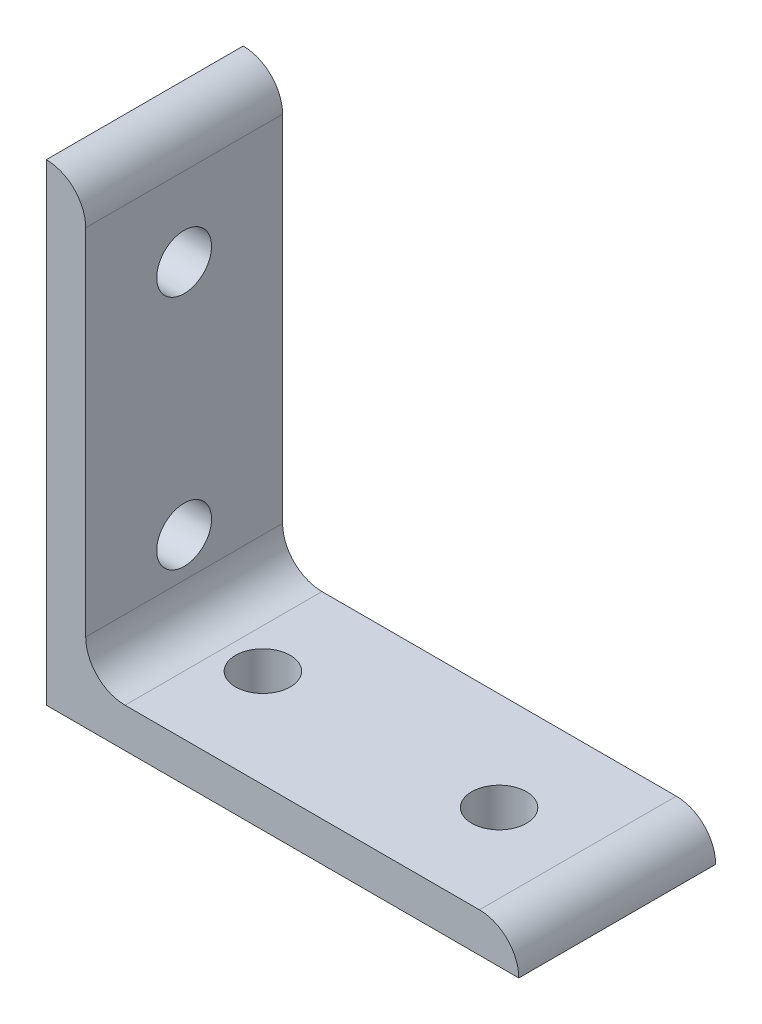
ISO-10303-21;
HEADER;
FILE_DESCRIPTION(('STEP AP214'),'2;1');
FILE_NAME('part.step','',(''),(''),'','','');
FILE_SCHEMA(('AUTOMOTIVE_DESIGN { 1 0 10303 214 1 1 1 1 }'));
ENDSEC;
DATA;
#1=APPLICATION_CONTEXT('core data for automotive mechanical design processes');
#2=APPLICATION_PROTOCOL_DEFINITION('international standard','automotive_design',2000,#1);
#3=PRODUCT_CONTEXT('',#1,'mechanical');
#4=PRODUCT('Part','Part','',(#3));
#5=PRODUCT_RELATED_PRODUCT_CATEGORY('part','',(#4));
#6=PRODUCT_DEFINITION_FORMATION('','',#4);
#7=PRODUCT_DEFINITION_CONTEXT('part definition',#1,'design');
#8=PRODUCT_DEFINITION('design','',#6,#7);
#9=PRODUCT_DEFINITION_SHAPE('','',#8);
#10=(LENGTH_UNIT() NAMED_UNIT(*) SI_UNIT(.MILLI.,.METRE.));
#11=(NAMED_UNIT(*) PLANE_ANGLE_UNIT() SI_UNIT($,.RADIAN.));
#12=(NAMED_UNIT(*) SI_UNIT($,.STERADIAN.) SOLID_ANGLE_UNIT());
#13=UNCERTAINTY_MEASURE_WITH_UNIT(LENGTH_MEASURE(1.E-05),#10,'distance_accuracy_value','');
#14=(GEOMETRIC_REPRESENTATION_CONTEXT(3) GLOBAL_UNCERTAINTY_ASSIGNED_CONTEXT((#13)) GLOBAL_UNIT_ASSIGNED_CONTEXT((#10,
#11,#12)) REPRESENTATION_CONTEXT('',''));
#15=CARTESIAN_POINT('',(0.,0.,0.));
#16=DIRECTION('',(0.,0.,1.));
#17=DIRECTION('',(1.,0.,0.));
#18=AXIS2_PLACEMENT_3D('',#15,#16,#17);
#19=CARTESIAN_POINT('',(0.,0.,15.875));
#20=DIRECTION('',(1.,0.,0.));
#21=DIRECTION('',(0.,0.,-1.));
#22=AXIS2_PLACEMENT_3D('',#19,#20,#21);
#23=PLANE('',#22);
#24=CARTESIAN_POINT('',(0.,57.15,0.));
#25=DIRECTION('',(1.,0.,0.));
#26=DIRECTION('',(0.,0.,-1.));
#27=AXIS2_PLACEMENT_3D('',#24,#25,#26);
#28=CIRCLE('',#27,4.4196);
#29=CARTESIAN_POINT('',(0.,57.15,-4.4196));
#30=VERTEX_POINT('',#29);
#31=EDGE_CURVE('E153',#30,#30,#28,.T.);
#32=ORIENTED_EDGE('',*,*,#31,.T.);
#33=EDGE_LOOP('',(#32));
#34=FACE_BOUND('',#33,.T.);
#35=CARTESIAN_POINT('',(0.,19.05,0.));
#36=DIRECTION('',(1.,0.,0.));
#37=DIRECTION('',(0.,0.,-1.));
#38=AXIS2_PLACEMENT_3D('',#35,#36,#37);
#39=CIRCLE('',#38,4.4196);
#40=CARTESIAN_POINT('',(0.,19.05,-4.4196));
#41=VERTEX_POINT('',#40);
#42=EDGE_CURVE('E141',#41,#41,#39,.T.);
#43=ORIENTED_EDGE('',*,*,#42,.T.);
#44=EDGE_LOOP('',(#43));
#45=FACE_BOUND('',#44,.T.);
#46=DIRECTION('',(0.,-1.,0.));
#47=VECTOR('',#46,1.);
#48=CARTESIAN_POINT('',(0.,0.,-15.875));
#49=LINE('',#48,#47);
#50=CARTESIAN_POINT('',(0.,76.2,-15.875));
#51=VERTEX_POINT('',#50);
#52=CARTESIAN_POINT('',(0.,0.,-15.875));
#53=VERTEX_POINT('',#52);
#54=EDGE_CURVE('E115',#51,#53,#49,.T.);
#55=ORIENTED_EDGE('',*,*,#54,.T.);
#56=DIRECTION('',(0.,0.,-1.));
#57=VECTOR('',#56,1.);
#58=CARTESIAN_POINT('',(0.,0.,15.875));
#59=LINE('',#58,#57);
#60=CARTESIAN_POINT('',(0.,0.,15.875));
#61=VERTEX_POINT('',#60);
#62=EDGE_CURVE('E96',#61,#53,#59,.T.);
#63=ORIENTED_EDGE('',*,*,#62,.F.);
#64=DIRECTION('',(0.,-1.,0.));
#65=VECTOR('',#64,1.);
#66=CARTESIAN_POINT('',(0.,0.,15.875));
#67=LINE('',#66,#65);
#68=CARTESIAN_POINT('',(0.,76.2,15.875));
#69=VERTEX_POINT('',#68);
#70=EDGE_CURVE('E103',#69,#61,#67,.T.);
#71=ORIENTED_EDGE('',*,*,#70,.F.);
#72=DIRECTION('',(0.,0.,-1.));
#73=VECTOR('',#72,1.);
#74=CARTESIAN_POINT('',(0.,76.2,15.875));
#75=LINE('',#74,#73);
#76=EDGE_CURVE('E129',#69,#51,#75,.T.);
#77=ORIENTED_EDGE('',*,*,#76,.T.);
#78=EDGE_LOOP('',(#55,#63,#71,#77));
#79=FACE_BOUND('',#78,.T.);
#80=ADVANCED_FACE('F33',(#34,#45,#79),#23,.F.);
#81=CARTESIAN_POINT('',(0.,0.,15.875));
#82=DIRECTION('',(0.,1.,0.));
#83=DIRECTION('',(-1.,0.,0.));
#84=AXIS2_PLACEMENT_3D('',#81,#82,#83);
#85=PLANE('',#84);
#86=CARTESIAN_POINT('',(19.05,0.,0.));
#87=DIRECTION('',(0.,1.,0.));
#88=DIRECTION('',(0.,0.,1.));
#89=AXIS2_PLACEMENT_3D('',#86,#87,#88);
#90=CIRCLE('',#89,4.4196);
#91=CARTESIAN_POINT('',(19.05,0.,4.4196));
#92=VERTEX_POINT('',#91);
#93=EDGE_CURVE('E165',#92,#92,#90,.T.);
#94=ORIENTED_EDGE('',*,*,#93,.T.);
#95=EDGE_LOOP('',(#94));
#96=FACE_BOUND('',#95,.T.);
#97=CARTESIAN_POINT('',(57.15,0.,0.));
#98=DIRECTION('',(0.,1.,0.));
#99=DIRECTION('',(0.,0.,1.));
#100=AXIS2_PLACEMENT_3D('',#97,#98,#99);
#101=CIRCLE('',#100,4.4196);
#102=CARTESIAN_POINT('',(57.15,0.,4.4196));
#103=VERTEX_POINT('',#102);
#104=EDGE_CURVE('E159',#103,#103,#101,.T.);
#105=ORIENTED_EDGE('',*,*,#104,.T.);
#106=EDGE_LOOP('',(#105));
#107=FACE_BOUND('',#106,.T.);
#108=DIRECTION('',(1.,0.,0.));
#109=VECTOR('',#108,1.);
#110=CARTESIAN_POINT('',(0.,0.,-15.875));
#111=LINE('',#110,#109);
#112=CARTESIAN_POINT('',(76.2,0.,-15.875));
#113=VERTEX_POINT('',#112);
#114=EDGE_CURVE('E138',#53,#113,#111,.T.);
#115=ORIENTED_EDGE('',*,*,#114,.T.);
#116=DIRECTION('',(0.,0.,-1.));
#117=VECTOR('',#116,1.);
#118=CARTESIAN_POINT('',(76.2,0.,15.875));
#119=LINE('',#118,#117);
#120=CARTESIAN_POINT('',(76.2,0.,15.875));
#121=VERTEX_POINT('',#120);
#122=EDGE_CURVE('E99',#121,#113,#119,.T.);
#123=ORIENTED_EDGE('',*,*,#122,.F.);
#124=DIRECTION('',(1.,0.,0.));
#125=VECTOR('',#124,1.);
#126=CARTESIAN_POINT('',(0.,0.,15.875));
#127=LINE('',#126,#125);
#128=EDGE_CURVE('E92',#61,#121,#127,.T.);
#129=ORIENTED_EDGE('',*,*,#128,.F.);
#130=ORIENTED_EDGE('',*,*,#62,.T.);
#131=EDGE_LOOP('',(#115,#123,#129,#130));
#132=FACE_BOUND('',#131,.T.);
#133=ADVANCED_FACE('F94',(#96,#107,#132),#85,.F.);
#134=CARTESIAN_POINT('',(69.8500000000001,0.,15.875));
#135=DIRECTION('',(0.,0.,-1.));
#136=DIRECTION('',(-1.,0.,0.));
#137=AXIS2_PLACEMENT_3D('',#134,#135,#136);
#138=CYLINDRICAL_SURFACE('',#137,6.34999999999997);
#139=CARTESIAN_POINT('',(69.8500000000001,0.,-15.875));
#140=DIRECTION('',(0.,0.,1.));
#141=DIRECTION('',(1.,0.,0.));
#142=AXIS2_PLACEMENT_3D('',#139,#140,#141);
#143=CIRCLE('',#142,6.34999999999997);
#144=CARTESIAN_POINT('',(69.8500000000001,6.34999999999999,-15.875));
#145=VERTEX_POINT('',#144);
#146=EDGE_CURVE('E136',#113,#145,#143,.T.);
#147=ORIENTED_EDGE('',*,*,#146,.T.);
#148=DIRECTION('',(0.,0.,-1.));
#149=VECTOR('',#148,1.);
#150=CARTESIAN_POINT('',(69.8500000000001,6.34999999999999,15.875));
#151=LINE('',#150,#149);
#152=CARTESIAN_POINT('',(69.8500000000001,6.34999999999999,15.875));
#153=VERTEX_POINT('',#152);
#154=EDGE_CURVE('E120',#153,#145,#151,.T.);
#155=ORIENTED_EDGE('',*,*,#154,.F.);
#156=CARTESIAN_POINT('',(69.8500000000001,0.,15.875));
#157=DIRECTION('',(0.,0.,1.));
#158=DIRECTION('',(1.,0.,0.));
#159=AXIS2_PLACEMENT_3D('',#156,#157,#158);
#160=CIRCLE('',#159,6.34999999999997);
#161=EDGE_CURVE('E102',#121,#153,#160,.T.);
#162=ORIENTED_EDGE('',*,*,#161,.F.);
#163=ORIENTED_EDGE('',*,*,#122,.T.);
#164=EDGE_LOOP('',(#147,#155,#162,#163));
#165=FACE_BOUND('',#164,.T.);
#166=ADVANCED_FACE('F178',(#165),#138,.T.);
#167=CARTESIAN_POINT('',(69.8500000000001,6.35,15.875));
#168=DIRECTION('',(0.,-1.,0.));
#169=DIRECTION('',(1.,0.,0.));
#170=AXIS2_PLACEMENT_3D('',#167,#168,#169);
#171=PLANE('',#170);
#172=CARTESIAN_POINT('',(19.05,6.35,0.));
#173=DIRECTION('',(0.,1.,0.));
#174=DIRECTION('',(0.,0.,1.));
#175=AXIS2_PLACEMENT_3D('',#172,#173,#174);
#176=CIRCLE('',#175,4.4196);
#177=CARTESIAN_POINT('',(19.05,6.35,4.4196));
#178=VERTEX_POINT('',#177);
#179=EDGE_CURVE('E168',#178,#178,#176,.T.);
#180=ORIENTED_EDGE('',*,*,#179,.F.);
#181=EDGE_LOOP('',(#180));
#182=FACE_BOUND('',#181,.T.);
#183=CARTESIAN_POINT('',(57.15,6.35,0.));
#184=DIRECTION('',(0.,1.,0.));
#185=DIRECTION('',(0.,0.,1.));
#186=AXIS2_PLACEMENT_3D('',#183,#184,#185);
#187=CIRCLE('',#186,4.4196);
#188=CARTESIAN_POINT('',(57.15,6.35,4.4196));
#189=VERTEX_POINT('',#188);
#190=EDGE_CURVE('E162',#189,#189,#187,.T.);
#191=ORIENTED_EDGE('',*,*,#190,.F.);
#192=EDGE_LOOP('',(#191));
#193=FACE_BOUND('',#192,.T.);
#194=DIRECTION('',(-1.,0.,0.));
#195=VECTOR('',#194,1.);
#196=CARTESIAN_POINT('',(69.8500000000001,6.35,-15.875));
#197=LINE('',#196,#195);
#198=CARTESIAN_POINT('',(12.7,6.35,-15.875));
#199=VERTEX_POINT('',#198);
#200=EDGE_CURVE('E134',#145,#199,#197,.T.);
#201=ORIENTED_EDGE('',*,*,#200,.T.);
#202=DIRECTION('',(0.,0.,-1.));
#203=VECTOR('',#202,1.);
#204=CARTESIAN_POINT('',(12.7,6.35,15.875));
#205=LINE('',#204,#203);
#206=CARTESIAN_POINT('',(12.7,6.35,15.875));
#207=VERTEX_POINT('',#206);
#208=EDGE_CURVE('E48',#199,#207,#205,.F.);
#209=ORIENTED_EDGE('',*,*,#208,.T.);
#210=DIRECTION('',(-1.,0.,0.));
#211=VECTOR('',#210,1.);
#212=CARTESIAN_POINT('',(69.8500000000001,6.35,15.875));
#213=LINE('',#212,#211);
#214=EDGE_CURVE('E145',#153,#207,#213,.T.);
#215=ORIENTED_EDGE('',*,*,#214,.F.);
#216=ORIENTED_EDGE('',*,*,#154,.T.);
#217=EDGE_LOOP('',(#201,#209,#215,#216));
#218=FACE_BOUND('',#217,.T.);
#219=ADVANCED_FACE('F174',(#182,#193,#218),#171,.F.);
#220=CARTESIAN_POINT('',(6.35,69.85,15.875));
#221=DIRECTION('',(-1.,0.,0.));
#222=DIRECTION('',(0.,0.,1.));
#223=AXIS2_PLACEMENT_3D('',#220,#221,#222);
#224=PLANE('',#223);
#225=CARTESIAN_POINT('',(6.35,57.15,0.));
#226=DIRECTION('',(1.,0.,0.));
#227=DIRECTION('',(0.,0.,-1.));
#228=AXIS2_PLACEMENT_3D('',#225,#226,#227);
#229=CIRCLE('',#228,4.4196);
#230=CARTESIAN_POINT('',(6.35,57.15,-4.4196));
#231=VERTEX_POINT('',#230);
#232=EDGE_CURVE('E156',#231,#231,#229,.T.);
#233=ORIENTED_EDGE('',*,*,#232,.F.);
#234=EDGE_LOOP('',(#233));
#235=FACE_BOUND('',#234,.T.);
#236=CARTESIAN_POINT('',(6.35,19.05,0.));
#237=DIRECTION('',(1.,0.,0.));
#238=DIRECTION('',(0.,0.,-1.));
#239=AXIS2_PLACEMENT_3D('',#236,#237,#238);
#240=CIRCLE('',#239,4.4196);
#241=CARTESIAN_POINT('',(6.35,19.05,-4.4196));
#242=VERTEX_POINT('',#241);
#243=EDGE_CURVE('E150',#242,#242,#240,.T.);
#244=ORIENTED_EDGE('',*,*,#243,.F.);
#245=EDGE_LOOP('',(#244));
#246=FACE_BOUND('',#245,.T.);
#247=DIRECTION('',(0.,1.,0.));
#248=VECTOR('',#247,1.);
#249=CARTESIAN_POINT('',(6.35,69.85,15.875));
#250=LINE('',#249,#248);
#251=CARTESIAN_POINT('',(6.35,12.7,15.875));
#252=VERTEX_POINT('',#251);
#253=CARTESIAN_POINT('',(6.35,69.85,15.875));
#254=VERTEX_POINT('',#253);
#255=EDGE_CURVE('E143',#252,#254,#250,.T.);
#256=ORIENTED_EDGE('',*,*,#255,.F.);
#257=DIRECTION('',(0.,0.,-1.));
#258=VECTOR('',#257,1.);
#259=CARTESIAN_POINT('',(6.35,12.7,-15.875));
#260=LINE('',#259,#258);
#261=CARTESIAN_POINT('',(6.35,12.7,-15.875));
#262=VERTEX_POINT('',#261);
#263=EDGE_CURVE('E116',#252,#262,#260,.T.);
#264=ORIENTED_EDGE('',*,*,#263,.T.);
#265=DIRECTION('',(0.,1.,0.));
#266=VECTOR('',#265,1.);
#267=CARTESIAN_POINT('',(6.35,69.85,-15.875));
#268=LINE('',#267,#266);
#269=CARTESIAN_POINT('',(6.35,69.85,-15.875));
#270=VERTEX_POINT('',#269);
#271=EDGE_CURVE('E132',#262,#270,#268,.T.);
#272=ORIENTED_EDGE('',*,*,#271,.T.);
#273=DIRECTION('',(0.,0.,-1.));
#274=VECTOR('',#273,1.);
#275=CARTESIAN_POINT('',(6.35,69.85,15.875));
#276=LINE('',#275,#274);
#277=EDGE_CURVE('E126',#254,#270,#276,.T.);
#278=ORIENTED_EDGE('',*,*,#277,.F.);
#279=EDGE_LOOP('',(#256,#264,#272,#278));
#280=FACE_BOUND('',#279,.T.);
#281=ADVANCED_FACE('F177',(#235,#246,#280),#224,.F.);
#282=CARTESIAN_POINT('',(0.,69.85,15.875));
#283=DIRECTION('',(0.,0.,-1.));
#284=DIRECTION('',(-1.,0.,0.));
#285=AXIS2_PLACEMENT_3D('',#282,#283,#284);
#286=CYLINDRICAL_SURFACE('',#285,6.35);
#287=CARTESIAN_POINT('',(0.,69.85,-15.875));
#288=DIRECTION('',(0.,0.,1.));
#289=DIRECTION('',(-1.,0.,0.));
#290=AXIS2_PLACEMENT_3D('',#287,#288,#289);
#291=CIRCLE('',#290,6.35);
#292=EDGE_CURVE('E112',#270,#51,#291,.T.);
#293=ORIENTED_EDGE('',*,*,#292,.T.);
#294=ORIENTED_EDGE('',*,*,#76,.F.);
#295=CARTESIAN_POINT('',(0.,69.85,15.875));
#296=DIRECTION('',(0.,0.,1.));
#297=DIRECTION('',(-1.,0.,0.));
#298=AXIS2_PLACEMENT_3D('',#295,#296,#297);
#299=CIRCLE('',#298,6.35);
#300=EDGE_CURVE('E108',#254,#69,#299,.T.);
#301=ORIENTED_EDGE('',*,*,#300,.F.);
#302=ORIENTED_EDGE('',*,*,#277,.T.);
#303=EDGE_LOOP('',(#293,#294,#301,#302));
#304=FACE_BOUND('',#303,.T.);
#305=ADVANCED_FACE('F191',(#304),#286,.T.);
#306=CARTESIAN_POINT('',(0.,69.85,15.875));
#307=DIRECTION('',(0.,0.,-1.));
#308=DIRECTION('',(-1.,0.,0.));
#309=AXIS2_PLACEMENT_3D('',#306,#307,#308);
#310=PLANE('',#309);
#311=ORIENTED_EDGE('',*,*,#70,.T.);
#312=ORIENTED_EDGE('',*,*,#128,.T.);
#313=ORIENTED_EDGE('',*,*,#161,.T.);
#314=ORIENTED_EDGE('',*,*,#214,.T.);
#315=CARTESIAN_POINT('',(12.7,12.7,15.875));
#316=DIRECTION('',(0.,0.,-1.));
#317=DIRECTION('',(-1.,0.,0.));
#318=AXIS2_PLACEMENT_3D('',#315,#316,#317);
#319=CIRCLE('',#318,6.35);
#320=EDGE_CURVE('E11',#207,#252,#319,.T.);
#321=ORIENTED_EDGE('',*,*,#320,.T.);
#322=ORIENTED_EDGE('',*,*,#255,.T.);
#323=ORIENTED_EDGE('',*,*,#300,.T.);
#324=EDGE_LOOP('',(#311,#312,#313,#314,#321,#322,#323));
#325=FACE_BOUND('',#324,.T.);
#326=ADVANCED_FACE('F106',(#325),#310,.F.);
#327=CARTESIAN_POINT('',(0.,69.85,-15.875));
#328=DIRECTION('',(0.,0.,-1.));
#329=DIRECTION('',(-1.,0.,0.));
#330=AXIS2_PLACEMENT_3D('',#327,#328,#329);
#331=PLANE('',#330);
#332=ORIENTED_EDGE('',*,*,#54,.F.);
#333=ORIENTED_EDGE('',*,*,#292,.F.);
#334=ORIENTED_EDGE('',*,*,#271,.F.);
#335=CARTESIAN_POINT('',(12.7,12.7,-15.875));
#336=DIRECTION('',(0.,0.,-1.));
#337=DIRECTION('',(-1.,0.,0.));
#338=AXIS2_PLACEMENT_3D('',#335,#336,#337);
#339=CIRCLE('',#338,6.35);
#340=EDGE_CURVE('E41',#262,#199,#339,.F.);
#341=ORIENTED_EDGE('',*,*,#340,.T.);
#342=ORIENTED_EDGE('',*,*,#200,.F.);
#343=ORIENTED_EDGE('',*,*,#146,.F.);
#344=ORIENTED_EDGE('',*,*,#114,.F.);
#345=EDGE_LOOP('',(#332,#333,#334,#341,#342,#343,#344));
#346=FACE_BOUND('',#345,.T.);
#347=ADVANCED_FACE('F192',(#346),#331,.T.);
#348=CARTESIAN_POINT('',(6.35,19.05,0.));
#349=DIRECTION('',(1.,0.,0.));
#350=DIRECTION('',(0.,0.,-1.));
#351=AXIS2_PLACEMENT_3D('',#348,#349,#350);
#352=CYLINDRICAL_SURFACE('',#351,4.4196);
#353=ORIENTED_EDGE('',*,*,#42,.F.);
#354=EDGE_LOOP('',(#353));
#355=FACE_BOUND('',#354,.T.);
#356=ORIENTED_EDGE('',*,*,#243,.T.);
#357=EDGE_LOOP('',(#356));
#358=FACE_BOUND('',#357,.T.);
#359=ADVANCED_FACE('F209',(#355,#358),#352,.F.);
#360=CARTESIAN_POINT('',(6.35,57.15,0.));
#361=DIRECTION('',(1.,0.,0.));
#362=DIRECTION('',(0.,0.,-1.));
#363=AXIS2_PLACEMENT_3D('',#360,#361,#362);
#364=CYLINDRICAL_SURFACE('',#363,4.4196);
#365=ORIENTED_EDGE('',*,*,#31,.F.);
#366=EDGE_LOOP('',(#365));
#367=FACE_BOUND('',#366,.T.);
#368=ORIENTED_EDGE('',*,*,#232,.T.);
#369=EDGE_LOOP('',(#368));
#370=FACE_BOUND('',#369,.T.);
#371=ADVANCED_FACE('F212',(#367,#370),#364,.F.);
#372=CARTESIAN_POINT('',(57.15,6.35,0.));
#373=DIRECTION('',(0.,1.,0.));
#374=DIRECTION('',(0.,0.,1.));
#375=AXIS2_PLACEMENT_3D('',#372,#373,#374);
#376=CYLINDRICAL_SURFACE('',#375,4.4196);
#377=ORIENTED_EDGE('',*,*,#104,.F.);
#378=EDGE_LOOP('',(#377));
#379=FACE_BOUND('',#378,.T.);
#380=ORIENTED_EDGE('',*,*,#190,.T.);
#381=EDGE_LOOP('',(#380));
#382=FACE_BOUND('',#381,.T.);
#383=ADVANCED_FACE('F231',(#379,#382),#376,.F.);
#384=CARTESIAN_POINT('',(19.05,6.35,0.));
#385=DIRECTION('',(0.,1.,0.));
#386=DIRECTION('',(0.,0.,1.));
#387=AXIS2_PLACEMENT_3D('',#384,#385,#386);
#388=CYLINDRICAL_SURFACE('',#387,4.4196);
#389=ORIENTED_EDGE('',*,*,#93,.F.);
#390=EDGE_LOOP('',(#389));
#391=FACE_BOUND('',#390,.T.);
#392=ORIENTED_EDGE('',*,*,#179,.T.);
#393=EDGE_LOOP('',(#392));
#394=FACE_BOUND('',#393,.T.);
#395=ADVANCED_FACE('F172',(#391,#394),#388,.F.);
#396=CARTESIAN_POINT('',(12.7,12.7,15.875));
#397=DIRECTION('',(0.,0.,1.));
#398=DIRECTION('',(1.,0.,0.));
#399=AXIS2_PLACEMENT_3D('',#396,#397,#398);
#400=CYLINDRICAL_SURFACE('',#399,6.35);
#401=ORIENTED_EDGE('',*,*,#320,.F.);
#402=ORIENTED_EDGE('',*,*,#208,.F.);
#403=ORIENTED_EDGE('',*,*,#340,.F.);
#404=ORIENTED_EDGE('',*,*,#263,.F.);
#405=EDGE_LOOP('',(#401,#402,#403,#404));
#406=FACE_BOUND('',#405,.T.);
#407=ADVANCED_FACE('F35',(#406),#400,.F.);
#408=CLOSED_SHELL('',(#80,#133,#166,#219,#281,#305,#326,#347,#359,#371,#383,#395,#407));
#409=MANIFOLD_SOLID_BREP('B2',#408);
#410=ADVANCED_BREP_SHAPE_REPRESENTATION('',(#18,#409),#14);
#411=SHAPE_DEFINITION_REPRESENTATION(#9,#410);
ENDSEC;
END-ISO-10303-21;
